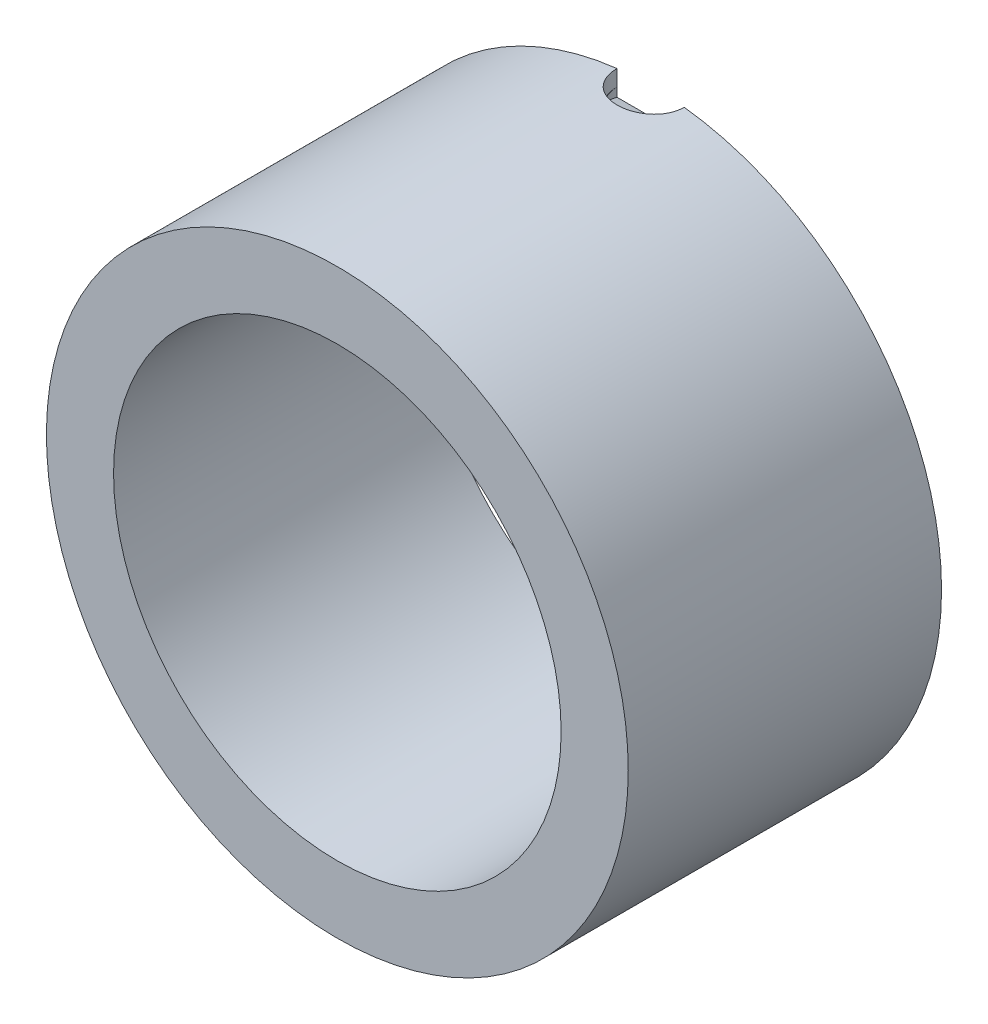
ISO-10303-21;
HEADER;
FILE_DESCRIPTION(('STEP AP214'),'2;1');
FILE_NAME('part.step','',(''),(''),'','','');
FILE_SCHEMA(('AUTOMOTIVE_DESIGN { 1 0 10303 214 1 1 1 1 }'));
ENDSEC;
DATA;
#1=APPLICATION_CONTEXT('core data for automotive mechanical design processes');
#2=APPLICATION_PROTOCOL_DEFINITION('international standard','automotive_design',2000,#1);
#3=PRODUCT_CONTEXT('',#1,'mechanical');
#4=PRODUCT('Part','Part','',(#3));
#5=PRODUCT_RELATED_PRODUCT_CATEGORY('part','',(#4));
#6=PRODUCT_DEFINITION_FORMATION('','',#4);
#7=PRODUCT_DEFINITION_CONTEXT('part definition',#1,'design');
#8=PRODUCT_DEFINITION('design','',#6,#7);
#9=PRODUCT_DEFINITION_SHAPE('','',#8);
#10=(LENGTH_UNIT() NAMED_UNIT(*) SI_UNIT(.MILLI.,.METRE.));
#11=(NAMED_UNIT(*) PLANE_ANGLE_UNIT() SI_UNIT($,.RADIAN.));
#12=(NAMED_UNIT(*) SI_UNIT($,.STERADIAN.) SOLID_ANGLE_UNIT());
#13=UNCERTAINTY_MEASURE_WITH_UNIT(LENGTH_MEASURE(1.E-05),#10,'distance_accuracy_value','');
#14=(GEOMETRIC_REPRESENTATION_CONTEXT(3) GLOBAL_UNCERTAINTY_ASSIGNED_CONTEXT((#13)) GLOBAL_UNIT_ASSIGNED_CONTEXT((#10,
#11,#12)) REPRESENTATION_CONTEXT('',''));
#15=CARTESIAN_POINT('',(0.,0.,0.));
#16=DIRECTION('',(0.,0.,1.));
#17=DIRECTION('',(1.,0.,0.));
#18=AXIS2_PLACEMENT_3D('',#15,#16,#17);
#19=CARTESIAN_POINT('',(0.,0.,0.));
#20=DIRECTION('',(0.,0.,1.));
#21=DIRECTION('',(1.,0.,0.));
#22=AXIS2_PLACEMENT_3D('',#19,#20,#21);
#23=PLANE('',#22);
#24=CARTESIAN_POINT('',(0.,0.,0.));
#25=DIRECTION('',(0.,0.,1.));
#26=DIRECTION('',(1.,0.,0.));
#27=AXIS2_PLACEMENT_3D('',#24,#25,#26);
#28=CIRCLE('',#27,200.);
#29=CARTESIAN_POINT('',(200.,0.,0.));
#30=VERTEX_POINT('',#29);
#31=EDGE_CURVE('E109',#30,#30,#28,.T.);
#32=ORIENTED_EDGE('',*,*,#31,.T.);
#33=EDGE_LOOP('',(#32));
#34=FACE_BOUND('',#33,.T.);
#35=CARTESIAN_POINT('',(0.,240.070425072378,0.));
#36=DIRECTION('',(0.,0.,1.));
#37=DIRECTION('',(0.,-1.,0.));
#38=AXIS2_PLACEMENT_3D('',#35,#36,#37);
#39=ELLIPSE('',#38,115.911099154688,30.);
#40=CARTESIAN_POINT('',(-29.9813280557434,235.981524227066,0.));
#41=VERTEX_POINT('',#40);
#42=CARTESIAN_POINT('',(-29.9825792022188,244.02,0.));
#43=VERTEX_POINT('',#42);
#44=EDGE_CURVE('E86',#41,#43,#39,.F.);
#45=ORIENTED_EDGE('',*,*,#44,.F.);
#46=DIRECTION('',(-1.,0.,0.));
#47=VECTOR('',#46,1.);
#48=CARTESIAN_POINT('',(0.,235.981524227066,0.));
#49=LINE('',#48,#47);
#50=CARTESIAN_POINT('',(29.9813280557434,235.981524227066,0.));
#51=VERTEX_POINT('',#50);
#52=EDGE_CURVE('E91',#51,#41,#49,.T.);
#53=ORIENTED_EDGE('',*,*,#52,.F.);
#54=CARTESIAN_POINT('',(29.9825792022188,244.02,0.));
#55=VERTEX_POINT('',#54);
#56=EDGE_CURVE('E79',#55,#51,#39,.F.);
#57=ORIENTED_EDGE('',*,*,#56,.F.);
#58=DIRECTION('',(-1.,0.,0.));
#59=VECTOR('',#58,1.);
#60=CARTESIAN_POINT('',(0.,244.02,0.));
#61=LINE('',#60,#59);
#62=CARTESIAN_POINT('',(30.,244.02,0.));
#63=VERTEX_POINT('',#62);
#64=EDGE_CURVE('E11',#63,#55,#61,.T.);
#65=ORIENTED_EDGE('',*,*,#64,.F.);
#66=DIRECTION('',(0.,1.,0.));
#67=VECTOR('',#66,1.);
#68=CARTESIAN_POINT('',(30.,244.02,0.));
#69=LINE('',#68,#67);
#70=CARTESIAN_POINT('',(30.,258.263431402899,0.));
#71=VERTEX_POINT('',#70);
#72=EDGE_CURVE('E106',#63,#71,#69,.T.);
#73=ORIENTED_EDGE('',*,*,#72,.T.);
#74=CARTESIAN_POINT('',(0.,0.,0.));
#75=DIRECTION('',(0.,0.,1.));
#76=DIRECTION('',(1.,0.,0.));
#77=AXIS2_PLACEMENT_3D('',#74,#75,#76);
#78=CIRCLE('',#77,260.);
#79=CARTESIAN_POINT('',(-30.,258.263431402899,0.));
#80=VERTEX_POINT('',#79);
#81=EDGE_CURVE('E113',#80,#71,#78,.T.);
#82=ORIENTED_EDGE('',*,*,#81,.F.);
#83=DIRECTION('',(0.,1.,0.));
#84=VECTOR('',#83,1.);
#85=CARTESIAN_POINT('',(-30.,244.02,0.));
#86=LINE('',#85,#84);
#87=CARTESIAN_POINT('',(-30.,244.02,0.));
#88=VERTEX_POINT('',#87);
#89=EDGE_CURVE('E59',#80,#88,#86,.F.);
#90=ORIENTED_EDGE('',*,*,#89,.T.);
#91=EDGE_CURVE('E44',#43,#88,#61,.T.);
#92=ORIENTED_EDGE('',*,*,#91,.F.);
#93=EDGE_LOOP('',(#45,#53,#57,#65,#73,#82,#90,#92));
#94=FACE_BOUND('',#93,.T.);
#95=ADVANCED_FACE('F35',(#34,#94),#23,.F.);
#96=CARTESIAN_POINT('',(0.,244.02,0.));
#97=DIRECTION('',(0.,1.,0.));
#98=DIRECTION('',(0.,0.,1.));
#99=AXIS2_PLACEMENT_3D('',#96,#97,#98);
#100=PLANE('',#99);
#101=CARTESIAN_POINT('',(0.,244.02,0.));
#102=DIRECTION('',(0.,1.,0.));
#103=DIRECTION('',(0.,0.,1.));
#104=AXIS2_PLACEMENT_3D('',#101,#102,#103);
#105=CIRCLE('',#104,30.);
#106=CARTESIAN_POINT('',(0.,244.02,30.));
#107=VERTEX_POINT('',#106);
#108=EDGE_CURVE('E101',#88,#107,#105,.T.);
#109=ORIENTED_EDGE('',*,*,#108,.T.);
#110=CARTESIAN_POINT('',(0.,244.02,-1.05828541230249));
#111=DIRECTION('',(0.,1.,0.));
#112=DIRECTION('',(0.,0.,1.));
#113=AXIS2_PLACEMENT_3D('',#110,#111,#112);
#114=ELLIPSE('',#113,31.0582854123025,30.);
#115=EDGE_CURVE('E87',#107,#43,#114,.F.);
#116=ORIENTED_EDGE('',*,*,#115,.T.);
#117=ORIENTED_EDGE('',*,*,#91,.T.);
#118=EDGE_LOOP('',(#109,#116,#117));
#119=FACE_BOUND('',#118,.T.);
#120=ADVANCED_FACE('F133',(#119),#100,.T.);
#121=ORIENTED_EDGE('',*,*,#64,.T.);
#122=EDGE_CURVE('E82',#55,#107,#114,.F.);
#123=ORIENTED_EDGE('',*,*,#122,.T.);
#124=EDGE_CURVE('E104',#107,#63,#105,.T.);
#125=ORIENTED_EDGE('',*,*,#124,.T.);
#126=EDGE_LOOP('',(#121,#123,#125));
#127=FACE_BOUND('',#126,.T.);
#128=ADVANCED_FACE('F140',(#127),#100,.T.);
#129=CARTESIAN_POINT('',(0.,0.,280.));
#130=DIRECTION('',(0.,0.,1.));
#131=DIRECTION('',(1.,0.,0.));
#132=AXIS2_PLACEMENT_3D('',#129,#130,#131);
#133=PLANE('',#132);
#134=CARTESIAN_POINT('',(0.,0.,280.));
#135=DIRECTION('',(0.,0.,1.));
#136=DIRECTION('',(1.,0.,0.));
#137=AXIS2_PLACEMENT_3D('',#134,#135,#136);
#138=CIRCLE('',#137,260.);
#139=CARTESIAN_POINT('',(260.,0.,280.));
#140=VERTEX_POINT('',#139);
#141=EDGE_CURVE('E116',#140,#140,#138,.T.);
#142=ORIENTED_EDGE('',*,*,#141,.T.);
#143=EDGE_LOOP('',(#142));
#144=FACE_BOUND('',#143,.T.);
#145=CARTESIAN_POINT('',(0.,0.,280.));
#146=DIRECTION('',(0.,0.,1.));
#147=DIRECTION('',(1.,0.,0.));
#148=AXIS2_PLACEMENT_3D('',#145,#146,#147);
#149=CIRCLE('',#148,200.);
#150=CARTESIAN_POINT('',(200.,0.,280.));
#151=VERTEX_POINT('',#150);
#152=EDGE_CURVE('E110',#151,#151,#149,.T.);
#153=ORIENTED_EDGE('',*,*,#152,.F.);
#154=EDGE_LOOP('',(#153));
#155=FACE_BOUND('',#154,.T.);
#156=ADVANCED_FACE('F138',(#144,#155),#133,.T.);
#157=CARTESIAN_POINT('',(0.,0.,280.));
#158=DIRECTION('',(0.,0.,-1.));
#159=DIRECTION('',(-1.,0.,0.));
#160=AXIS2_PLACEMENT_3D('',#157,#158,#159);
#161=CYLINDRICAL_SURFACE('',#160,260.);
#162=ORIENTED_EDGE('',*,*,#141,.F.);
#163=EDGE_LOOP('',(#162));
#164=FACE_BOUND('',#163,.T.);
#165=ORIENTED_EDGE('',*,*,#81,.T.);
#166=CARTESIAN_POINT('',(30.,258.263431402899,0.));
#167=CARTESIAN_POINT('',(30.0000006807961,258.263429847028,0.420417209969276));
#168=CARTESIAN_POINT('',(29.9911613863199,258.26445827903,0.840787308827006));
#169=CARTESIAN_POINT('',(29.9558300055138,258.268559274607,1.68076440914387));
#170=CARTESIAN_POINT('',(29.9293383640342,258.27163178667,2.10037142956587));
#171=CARTESIAN_POINT('',(29.8234450294191,258.283889436098,3.35683858956521));
#172=CARTESIAN_POINT('',(29.7176248930701,258.296114704106,4.19158425456047));
#173=CARTESIAN_POINT('',(29.4364198023476,258.328312705491,5.84828610389616));
#174=CARTESIAN_POINT('',(29.2611024119779,258.348277913821,6.67025390646952));
#175=CARTESIAN_POINT('',(28.9470204643919,258.383592545678,7.88963350434463));
#176=CARTESIAN_POINT('',(28.8338027079675,258.396259237617,8.29384890853831));
#177=CARTESIAN_POINT('',(28.5904998860655,258.423292899877,9.0972255723574));
#178=CARTESIAN_POINT('',(28.4604105504546,258.437660300559,9.4963855242977));
#179=CARTESIAN_POINT('',(28.0451585572353,258.483165713917,10.6852056466378));
#180=CARTESIAN_POINT('',(27.7350146126995,258.516706630622,11.4661956094428));
#181=CARTESIAN_POINT('',(27.0504243926732,258.589235776876,12.999201852866));
#182=CARTESIAN_POINT('',(26.6759777863625,258.62822403445,13.7512179843972));
#183=CARTESIAN_POINT('',(26.0682172236889,258.689948424728,14.8534250294908));
#184=CARTESIAN_POINT('',(25.8579249075538,258.711065863653,15.2165600690924));
#185=CARTESIAN_POINT('',(25.4223833878465,258.754227640293,15.9335600130973));
#186=CARTESIAN_POINT('',(25.1971380299014,258.776271739158,16.2874272685948));
#187=CARTESIAN_POINT('',(24.4994262254003,258.843575366981,17.3343966904545));
#188=CARTESIAN_POINT('',(24.0049460092896,258.890010133236,18.0129354733151));
#189=CARTESIAN_POINT('',(22.9588753728411,258.984877735504,19.328723499738));
#190=CARTESIAN_POINT('',(22.4070597640977,259.033317963178,19.9657926248794));
#191=CARTESIAN_POINT('',(21.2518003613918,259.13065601856,21.1912715627103));
#192=CARTESIAN_POINT('',(20.6483561618242,259.17955384986,21.7796809930475));
#193=CARTESIAN_POINT('',(19.3938394359391,259.276444834752,22.9039018069075));
#194=CARTESIAN_POINT('',(18.7427488867689,259.324437637281,23.4396931055818));
#195=CARTESIAN_POINT('',(17.3976938799056,259.418146306469,24.4546530808851));
#196=CARTESIAN_POINT('',(16.7037300145708,259.46386220457,24.9338225395624));
#197=CARTESIAN_POINT('',(15.2754850467574,259.551869549834,25.8335864080498));
#198=CARTESIAN_POINT('',(14.5410819543532,259.594149562235,26.2539883319005));
#199=CARTESIAN_POINT('',(13.0391452602501,259.673922888584,27.0313855224424));
#200=CARTESIAN_POINT('',(12.271609600942,259.711415904674,27.3883768441265));
#201=CARTESIAN_POINT('',(10.709718925497,259.780507555505,28.0359728606701));
#202=CARTESIAN_POINT('',(9.91539374376889,259.81211250719,28.3266487773584));
#203=CARTESIAN_POINT('',(8.30508569257292,259.868572268534,28.8398985124381));
#204=CARTESIAN_POINT('',(7.48910810577991,259.893428708348,29.0624887790843));
#205=CARTESIAN_POINT('',(5.57316707822679,259.942552890539,29.4990343132851));
#206=CARTESIAN_POINT('',(4.46703948295751,259.964007678309,29.6867072086833));
#207=CARTESIAN_POINT('',(2.24052897812388,259.992729488721,29.9371850270599));
#208=CARTESIAN_POINT('',(1.12014585920178,259.999996302755,29.9999881140553));
#209=CARTESIAN_POINT('',(-0.839861036044469,260.000002772114,30.0000089118232));
#210=CARTESIAN_POINT('',(-1.67958869239231,259.995922456242,29.9647186530341));
#211=CARTESIAN_POINT('',(-3.35331410554595,259.979721097613,29.8238244748138));
#212=CARTESIAN_POINT('',(-4.18731047743167,259.967598175988,29.7182041252343));
#213=CARTESIAN_POINT('',(-5.84414240621954,259.935633161149,29.4372686046044));
#214=CARTESIAN_POINT('',(-6.66696636188074,259.91578359744,29.2618859803833));
#215=CARTESIAN_POINT('',(-8.2947506208183,259.868928591108,28.8427353929232));
#216=CARTESIAN_POINT('',(-9.09971196175245,259.841923565338,28.5989714133093));
#217=CARTESIAN_POINT('',(-10.685617681716,259.781536962614,28.045010889868));
#218=CARTESIAN_POINT('',(-11.4665769338561,259.748159430863,27.7348564749609));
#219=CARTESIAN_POINT('',(-12.9995392280071,259.67595356348,27.0502615768822));
#220=CARTESIAN_POINT('',(-13.7515418685885,259.637125152317,26.6758202028845));
#221=CARTESIAN_POINT('',(-15.2211990518995,259.555113121544,25.8654044076543));
#222=CARTESIAN_POINT('',(-15.9388596602383,259.511930275247,25.4294409067911));
#223=CARTESIAN_POINT('',(-17.334990093316,259.422411354387,24.4990171364721));
#224=CARTESIAN_POINT('',(-18.0134599434178,259.376075281866,24.0045569048739));
#225=CARTESIAN_POINT('',(-19.3292620397054,259.281346455516,22.9584192271938));
#226=CARTESIAN_POINT('',(-19.9664102345801,259.232945905747,22.4065109785801));
#227=CARTESIAN_POINT('',(-21.192006699202,259.135634079106,21.251073877949));
#228=CARTESIAN_POINT('',(-21.7804546271539,259.086722798653,20.6475446636983));
#229=CARTESIAN_POINT('',(-22.9045817893094,258.989765300078,19.3930287645835));
#230=CARTESIAN_POINT('',(-23.4402561383646,258.941719162377,18.7420376959544));
#231=CARTESIAN_POINT('',(-24.4549985698385,258.847856414851,17.397201040308));
#232=CARTESIAN_POINT('',(-24.9340674472944,258.802039773716,16.7033560553925));
#233=CARTESIAN_POINT('',(-25.8335966204993,258.713799875301,15.2754539889772));
#234=CARTESIAN_POINT('',(-26.2538717893775,258.671387508325,14.541279596731));
#235=CARTESIAN_POINT('',(-27.0310564933837,258.59132757746,13.0398084510534));
#236=CARTESIAN_POINT('',(-27.3879620398589,258.553680313541,12.2725096164574));
#237=CARTESIAN_POINT('',(-28.0356226295877,258.484254718661,10.7106638473453));
#238=CARTESIAN_POINT('',(-28.3264082358019,258.45247367741,9.91612969819142));
#239=CARTESIAN_POINT('',(-28.8398560262629,258.395684131334,8.3052377165355));
#240=CARTESIAN_POINT('',(-29.0625346782144,258.370673989528,7.4888852115255));
#241=CARTESIAN_POINT('',(-29.3748374944221,258.335313828321,6.11826483820948));
#242=CARTESIAN_POINT('',(-29.4840096406856,258.322863980901,5.56842038760236));
#243=CARTESIAN_POINT('',(-29.6713967574857,258.301407510355,4.46342360442846));
#244=CARTESIAN_POINT('',(-29.7496141413992,258.292400618803,3.90827168911389));
#245=CARTESIAN_POINT('',(-29.8747374407348,258.277959252738,2.79521241759142));
#246=CARTESIAN_POINT('',(-29.9216877160418,258.272519717242,2.23731010122777));
#247=CARTESIAN_POINT('',(-29.9843312077016,258.265251308612,1.11960765819636));
#248=CARTESIAN_POINT('',(-30.0000175751051,258.263423226635,0.559807142591611));
#249=CARTESIAN_POINT('',(-30.,258.263431402899,0.));
#250=B_SPLINE_CURVE_WITH_KNOTS('',3,(#166,#167,#168,#169,#170,#171,#172,#173,#174,#175,#176,
#177,#178,#179,#180,#181,#182,#183,#184,#185,#186,#187,#188,#189,#190,#191,#192,#193,#194,#195,
#196,#197,#198,#199,#200,#201,#202,#203,#204,#205,#206,#207,#208,#209,#210,#211,#212,#213,#214,
#215,#216,#217,#218,#219,#220,#221,#222,#223,#224,#225,#226,#227,#228,#229,#230,#231,#232,#233,
#234,#235,#236,#237,#238,#239,#240,#241,#242,#243,#244,#245,#246,#247,#248,#249),.UNSPECIFIED.,
.F.,.F.,(4,2,2,2,2,2,2,2,2,2,2,2,2,2,2,2,2,2,2,2,2,2,2,2,2,2,2,2,2,2,2,2,2,2,2,2,2,2,2,2,2,4),
(0.,1.26106346812658,2.52209515784521,5.04344260560657,7.56234483189254,8.82190722918958,
10.0817890413938,12.601585022784,15.1213939682455,16.3815542973801,17.6413917843694,
20.1608309495811,22.6905688945214,25.2203267154393,27.7510464463857,30.2817312195044,
32.820519894833,35.3594664622741,37.8956732632821,40.431266878066,43.7903477475235,
47.149478005781,49.668080914262,52.1872724121186,54.7089056613386,57.2303920407579,
59.7502830963037,62.2702090728677,64.7896883160296,67.3091659286576,69.8391879622115,
72.3692277508205,74.8995015207034,77.4297397480663,79.9677738958826,82.5059677377329,
85.0429859412888,87.5793902287556,89.2607305727081,90.9419398057316,92.6207587302551,
94.2999453913469),.UNSPECIFIED.);
#251=EDGE_CURVE('E119',#71,#80,#250,.T.);
#252=ORIENTED_EDGE('',*,*,#251,.T.);
#253=EDGE_LOOP('',(#165,#252));
#254=FACE_BOUND('',#253,.T.);
#255=ADVANCED_FACE('F37',(#164,#254),#161,.T.);
#256=CARTESIAN_POINT('',(0.,0.,280.));
#257=DIRECTION('',(0.,0.,-1.));
#258=DIRECTION('',(-1.,0.,0.));
#259=AXIS2_PLACEMENT_3D('',#256,#257,#258);
#260=CYLINDRICAL_SURFACE('',#259,200.);
#261=ORIENTED_EDGE('',*,*,#152,.T.);
#262=EDGE_LOOP('',(#261));
#263=FACE_BOUND('',#262,.T.);
#264=ORIENTED_EDGE('',*,*,#31,.F.);
#265=EDGE_LOOP('',(#264));
#266=FACE_BOUND('',#265,.T.);
#267=ADVANCED_FACE('F132',(#263,#266),#260,.F.);
#268=CARTESIAN_POINT('',(0.,244.02,0.));
#269=DIRECTION('',(0.,1.,0.));
#270=DIRECTION('',(0.,0.,1.));
#271=AXIS2_PLACEMENT_3D('',#268,#269,#270);
#272=CYLINDRICAL_SURFACE('',#271,30.);
#273=ORIENTED_EDGE('',*,*,#108,.F.);
#274=ORIENTED_EDGE('',*,*,#89,.F.);
#275=ORIENTED_EDGE('',*,*,#251,.F.);
#276=ORIENTED_EDGE('',*,*,#72,.F.);
#277=ORIENTED_EDGE('',*,*,#124,.F.);
#278=EDGE_LOOP('',(#273,#274,#275,#276,#277));
#279=FACE_BOUND('',#278,.T.);
#280=ADVANCED_FACE('F126',(#279),#272,.F.);
#281=CARTESIAN_POINT('',(0.,251.690923351024,-3.11370312941033));
#282=DIRECTION('',(0.,-0.965925826289068,0.258819045102521));
#283=DIRECTION('',(0.,-0.258819045102521,-0.965925826289068));
#284=AXIS2_PLACEMENT_3D('',#281,#282,#283);
#285=CYLINDRICAL_SURFACE('',#284,30.);
#286=ORIENTED_EDGE('',*,*,#44,.T.);
#287=ORIENTED_EDGE('',*,*,#115,.F.);
#288=CARTESIAN_POINT('',(0.,236.255428646924,1.02222521132796));
#289=DIRECTION('',(0.,0.965925826289068,-0.258819045102521));
#290=DIRECTION('',(0.,0.258819045102521,0.965925826289068));
#291=AXIS2_PLACEMENT_3D('',#288,#289,#290);
#292=CIRCLE('',#291,30.);
#293=EDGE_CURVE('E93',#41,#107,#292,.T.);
#294=ORIENTED_EDGE('',*,*,#293,.F.);
#295=EDGE_LOOP('',(#286,#287,#294));
#296=FACE_BOUND('',#295,.T.);
#297=ADVANCED_FACE('F131',(#296),#285,.F.);
#298=ORIENTED_EDGE('',*,*,#56,.T.);
#299=EDGE_CURVE('E51',#107,#51,#292,.T.);
#300=ORIENTED_EDGE('',*,*,#299,.F.);
#301=ORIENTED_EDGE('',*,*,#122,.F.);
#302=EDGE_LOOP('',(#298,#300,#301));
#303=FACE_BOUND('',#302,.T.);
#304=ADVANCED_FACE('F80',(#303),#285,.F.);
#305=CARTESIAN_POINT('',(0.,236.255428646924,1.02222521132796));
#306=DIRECTION('',(0.,0.965925826289068,-0.258819045102521));
#307=DIRECTION('',(0.,0.258819045102521,0.965925826289068));
#308=AXIS2_PLACEMENT_3D('',#305,#306,#307);
#309=PLANE('',#308);
#310=ORIENTED_EDGE('',*,*,#52,.T.);
#311=ORIENTED_EDGE('',*,*,#293,.T.);
#312=ORIENTED_EDGE('',*,*,#299,.T.);
#313=EDGE_LOOP('',(#310,#311,#312));
#314=FACE_BOUND('',#313,.T.);
#315=ADVANCED_FACE('F90',(#314),#309,.T.);
#316=CLOSED_SHELL('',(#95,#120,#128,#156,#255,#267,#280,#297,#304,#315));
#317=MANIFOLD_SOLID_BREP('B2',#316);
#318=ADVANCED_BREP_SHAPE_REPRESENTATION('',(#18,#317),#14);
#319=SHAPE_DEFINITION_REPRESENTATION(#9,#318);
ENDSEC;
END-ISO-10303-21;
